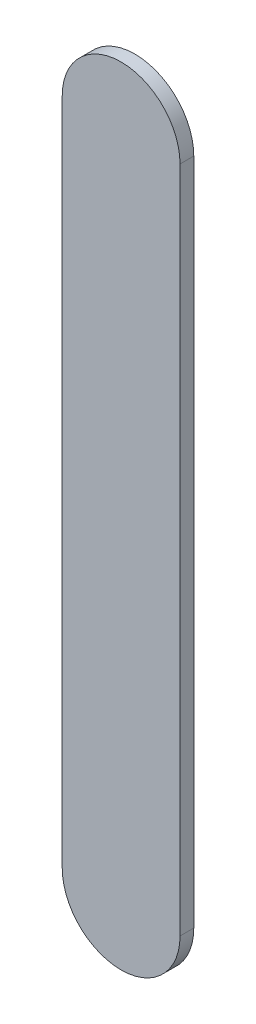
ISO-10303-21;
HEADER;
FILE_DESCRIPTION(('STEP AP214'),'2;1');
FILE_NAME('part.step','',(''),(''),'','','');
FILE_SCHEMA(('AUTOMOTIVE_DESIGN { 1 0 10303 214 1 1 1 1 }'));
ENDSEC;
DATA;
#1=APPLICATION_CONTEXT('core data for automotive mechanical design processes');
#2=APPLICATION_PROTOCOL_DEFINITION('international standard','automotive_design',2000,#1);
#3=PRODUCT_CONTEXT('',#1,'mechanical');
#4=PRODUCT('Part','Part','',(#3));
#5=PRODUCT_RELATED_PRODUCT_CATEGORY('part','',(#4));
#6=PRODUCT_DEFINITION_FORMATION('','',#4);
#7=PRODUCT_DEFINITION_CONTEXT('part definition',#1,'design');
#8=PRODUCT_DEFINITION('design','',#6,#7);
#9=PRODUCT_DEFINITION_SHAPE('','',#8);
#10=(LENGTH_UNIT() NAMED_UNIT(*) SI_UNIT(.MILLI.,.METRE.));
#11=(NAMED_UNIT(*) PLANE_ANGLE_UNIT() SI_UNIT($,.RADIAN.));
#12=(NAMED_UNIT(*) SI_UNIT($,.STERADIAN.) SOLID_ANGLE_UNIT());
#13=UNCERTAINTY_MEASURE_WITH_UNIT(LENGTH_MEASURE(1.E-05),#10,'distance_accuracy_value','');
#14=(GEOMETRIC_REPRESENTATION_CONTEXT(3) GLOBAL_UNCERTAINTY_ASSIGNED_CONTEXT((#13)) GLOBAL_UNIT_ASSIGNED_CONTEXT((#10,
#11,#12)) REPRESENTATION_CONTEXT('',''));
#15=CARTESIAN_POINT('',(0.,0.,0.));
#16=DIRECTION('',(0.,0.,1.));
#17=DIRECTION('',(1.,0.,0.));
#18=AXIS2_PLACEMENT_3D('',#15,#16,#17);
#19=CARTESIAN_POINT('',(131.018,-118.704,1.635));
#20=DIRECTION('',(0.,0.,1.));
#21=DIRECTION('',(1.,0.,0.));
#22=AXIS2_PLACEMENT_3D('',#19,#20,#21);
#23=PLANE('',#22);
#24=DIRECTION('',(0.,-1.,0.));
#25=VECTOR('',#24,1.);
#26=CARTESIAN_POINT('',(131.018,-118.704,1.635));
#27=LINE('',#26,#25);
#28=CARTESIAN_POINT('',(131.018,-118.704,1.635));
#29=VERTEX_POINT('',#28);
#30=CARTESIAN_POINT('',(131.018,-120.406336,1.635));
#31=VERTEX_POINT('',#30);
#32=EDGE_CURVE('E76',#29,#31,#27,.T.);
#33=ORIENTED_EDGE('',*,*,#32,.T.);
#34=CARTESIAN_POINT('',(131.168,-120.406336,1.635));
#35=DIRECTION('',(0.,0.,1.));
#36=DIRECTION('',(-1.,0.,0.));
#37=AXIS2_PLACEMENT_3D('',#34,#35,#36);
#38=CIRCLE('',#37,0.15);
#39=CARTESIAN_POINT('',(131.318,-120.406336,1.635));
#40=VERTEX_POINT('',#39);
#41=EDGE_CURVE('E74',#31,#40,#38,.T.);
#42=ORIENTED_EDGE('',*,*,#41,.T.);
#43=DIRECTION('',(0.,1.,0.));
#44=VECTOR('',#43,1.);
#45=CARTESIAN_POINT('',(131.318,-120.406336,1.635));
#46=LINE('',#45,#44);
#47=CARTESIAN_POINT('',(131.318,-118.704,1.635));
#48=VERTEX_POINT('',#47);
#49=EDGE_CURVE('E20',#40,#48,#46,.T.);
#50=ORIENTED_EDGE('',*,*,#49,.T.);
#51=CARTESIAN_POINT('',(131.168,-118.704,1.635));
#52=DIRECTION('',(0.,0.,1.));
#53=DIRECTION('',(1.,0.,0.));
#54=AXIS2_PLACEMENT_3D('',#51,#52,#53);
#55=CIRCLE('',#54,0.15);
#56=EDGE_CURVE('E11',#48,#29,#55,.T.);
#57=ORIENTED_EDGE('',*,*,#56,.T.);
#58=EDGE_LOOP('',(#33,#42,#50,#57));
#59=FACE_BOUND('',#58,.T.);
#60=ADVANCED_FACE('F17',(#59),#23,.T.);
#61=CARTESIAN_POINT('',(131.018,-118.704,1.6));
#62=DIRECTION('',(0.,0.,1.));
#63=DIRECTION('',(1.,0.,0.));
#64=AXIS2_PLACEMENT_3D('',#61,#62,#63);
#65=PLANE('',#64);
#66=CARTESIAN_POINT('',(131.168,-118.704,1.6));
#67=DIRECTION('',(0.,0.,1.));
#68=DIRECTION('',(1.,0.,0.));
#69=AXIS2_PLACEMENT_3D('',#66,#67,#68);
#70=CIRCLE('',#69,0.15);
#71=CARTESIAN_POINT('',(131.318,-118.704,1.6));
#72=VERTEX_POINT('',#71);
#73=CARTESIAN_POINT('',(131.018,-118.704,1.6));
#74=VERTEX_POINT('',#73);
#75=EDGE_CURVE('E27',#72,#74,#70,.T.);
#76=ORIENTED_EDGE('',*,*,#75,.F.);
#77=DIRECTION('',(0.,1.,0.));
#78=VECTOR('',#77,1.);
#79=CARTESIAN_POINT('',(131.318,-120.406336,1.6));
#80=LINE('',#79,#78);
#81=CARTESIAN_POINT('',(131.318,-120.406336,1.6));
#82=VERTEX_POINT('',#81);
#83=EDGE_CURVE('E57',#82,#72,#80,.T.);
#84=ORIENTED_EDGE('',*,*,#83,.F.);
#85=CARTESIAN_POINT('',(131.168,-120.406336,1.6));
#86=DIRECTION('',(0.,0.,1.));
#87=DIRECTION('',(-1.,0.,0.));
#88=AXIS2_PLACEMENT_3D('',#85,#86,#87);
#89=CIRCLE('',#88,0.15);
#90=CARTESIAN_POINT('',(131.018,-120.406336,1.6));
#91=VERTEX_POINT('',#90);
#92=EDGE_CURVE('E83',#91,#82,#89,.T.);
#93=ORIENTED_EDGE('',*,*,#92,.F.);
#94=DIRECTION('',(0.,-1.,0.));
#95=VECTOR('',#94,1.);
#96=CARTESIAN_POINT('',(131.018,-118.704,1.6));
#97=LINE('',#96,#95);
#98=EDGE_CURVE('E196',#74,#91,#97,.T.);
#99=ORIENTED_EDGE('',*,*,#98,.F.);
#100=EDGE_LOOP('',(#76,#84,#93,#99));
#101=FACE_BOUND('',#100,.T.);
#102=ADVANCED_FACE('F149',(#101),#65,.F.);
#103=CARTESIAN_POINT('',(131.168,-118.704,1.6));
#104=DIRECTION('',(0.,0.,-1.));
#105=DIRECTION('',(1.,0.,0.));
#106=AXIS2_PLACEMENT_3D('',#103,#104,#105);
#107=CYLINDRICAL_SURFACE('',#106,0.15);
#108=ORIENTED_EDGE('',*,*,#75,.T.);
#109=DIRECTION('',(0.,0.,1.));
#110=VECTOR('',#109,1.);
#111=CARTESIAN_POINT('',(131.018,-118.704,1.6));
#112=LINE('',#111,#110);
#113=EDGE_CURVE('E90',#74,#29,#112,.T.);
#114=ORIENTED_EDGE('',*,*,#113,.T.);
#115=ORIENTED_EDGE('',*,*,#56,.F.);
#116=DIRECTION('',(0.,0.,1.));
#117=VECTOR('',#116,1.);
#118=CARTESIAN_POINT('',(131.318,-118.704,1.6));
#119=LINE('',#118,#117);
#120=EDGE_CURVE('E69',#72,#48,#119,.T.);
#121=ORIENTED_EDGE('',*,*,#120,.F.);
#122=EDGE_LOOP('',(#108,#114,#115,#121));
#123=FACE_BOUND('',#122,.T.);
#124=ADVANCED_FACE('F140',(#123),#107,.T.);
#125=CARTESIAN_POINT('',(131.318,-120.406336,1.6));
#126=DIRECTION('',(-1.,0.,0.));
#127=DIRECTION('',(0.,0.,1.));
#128=AXIS2_PLACEMENT_3D('',#125,#126,#127);
#129=PLANE('',#128);
#130=ORIENTED_EDGE('',*,*,#83,.T.);
#131=ORIENTED_EDGE('',*,*,#120,.T.);
#132=ORIENTED_EDGE('',*,*,#49,.F.);
#133=DIRECTION('',(0.,0.,1.));
#134=VECTOR('',#133,1.);
#135=CARTESIAN_POINT('',(131.318,-120.406336,1.6));
#136=LINE('',#135,#134);
#137=EDGE_CURVE('E67',#82,#40,#136,.T.);
#138=ORIENTED_EDGE('',*,*,#137,.F.);
#139=EDGE_LOOP('',(#130,#131,#132,#138));
#140=FACE_BOUND('',#139,.T.);
#141=ADVANCED_FACE('F65',(#140),#129,.F.);
#142=CARTESIAN_POINT('',(131.168,-120.406336,1.6));
#143=DIRECTION('',(0.,0.,-1.));
#144=DIRECTION('',(-1.,0.,0.));
#145=AXIS2_PLACEMENT_3D('',#142,#143,#144);
#146=CYLINDRICAL_SURFACE('',#145,0.15);
#147=ORIENTED_EDGE('',*,*,#92,.T.);
#148=ORIENTED_EDGE('',*,*,#137,.T.);
#149=ORIENTED_EDGE('',*,*,#41,.F.);
#150=DIRECTION('',(0.,0.,1.));
#151=VECTOR('',#150,1.);
#152=CARTESIAN_POINT('',(131.018,-120.406336,1.6));
#153=LINE('',#152,#151);
#154=EDGE_CURVE('E197',#91,#31,#153,.T.);
#155=ORIENTED_EDGE('',*,*,#154,.F.);
#156=EDGE_LOOP('',(#147,#148,#149,#155));
#157=FACE_BOUND('',#156,.T.);
#158=ADVANCED_FACE('F82',(#157),#146,.T.);
#159=CARTESIAN_POINT('',(131.018,-118.704,1.6));
#160=DIRECTION('',(1.,0.,0.));
#161=DIRECTION('',(0.,1.,0.));
#162=AXIS2_PLACEMENT_3D('',#159,#160,#161);
#163=PLANE('',#162);
#164=ORIENTED_EDGE('',*,*,#98,.T.);
#165=ORIENTED_EDGE('',*,*,#154,.T.);
#166=ORIENTED_EDGE('',*,*,#32,.F.);
#167=ORIENTED_EDGE('',*,*,#113,.F.);
#168=EDGE_LOOP('',(#164,#165,#166,#167));
#169=FACE_BOUND('',#168,.T.);
#170=ADVANCED_FACE('F117',(#169),#163,.F.);
#171=CLOSED_SHELL('',(#60,#102,#124,#141,#158,#170));
#172=MANIFOLD_SOLID_BREP('B1',#171);
#173=ADVANCED_BREP_SHAPE_REPRESENTATION('',(#18,#172),#14);
#174=SHAPE_DEFINITION_REPRESENTATION(#9,#173);
ENDSEC;
END-ISO-10303-21;
